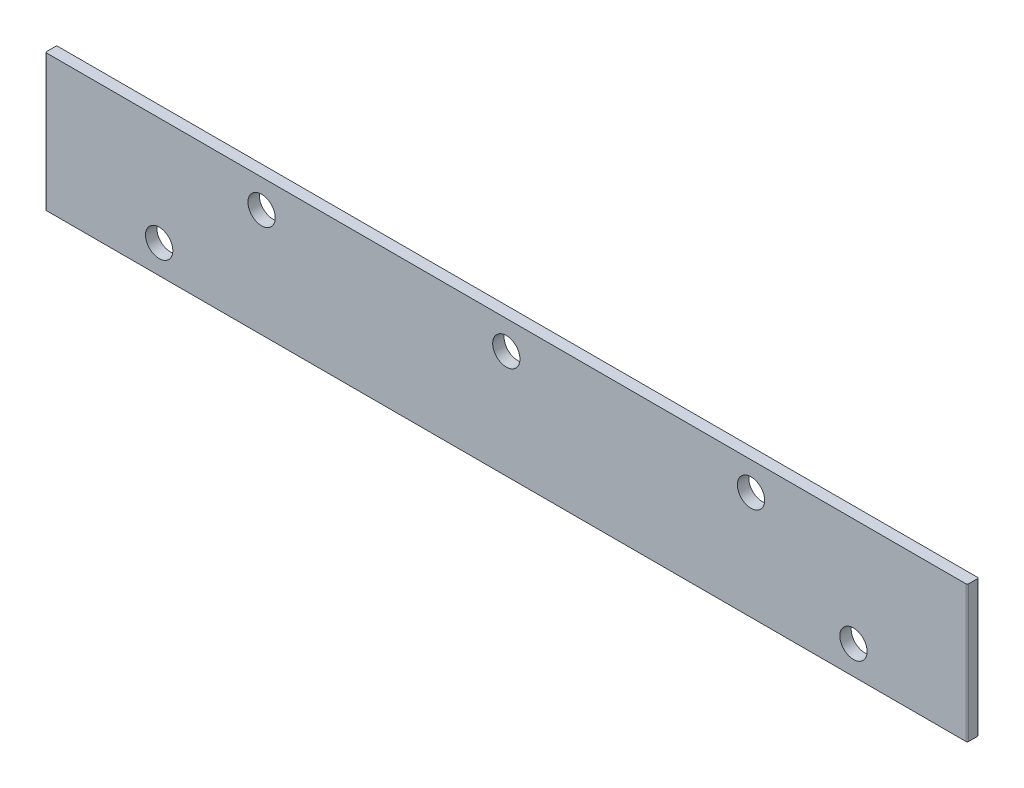
ISO-10303-21;
HEADER;
FILE_DESCRIPTION(('STEP AP214'),'2;1');
FILE_NAME('part.step','',(''),(''),'','','');
FILE_SCHEMA(('AUTOMOTIVE_DESIGN { 1 0 10303 214 1 1 1 1 }'));
ENDSEC;
DATA;
#1=APPLICATION_CONTEXT('core data for automotive mechanical design processes');
#2=APPLICATION_PROTOCOL_DEFINITION('international standard','automotive_design',2000,#1);
#3=PRODUCT_CONTEXT('',#1,'mechanical');
#4=PRODUCT('Part','Part','',(#3));
#5=PRODUCT_RELATED_PRODUCT_CATEGORY('part','',(#4));
#6=PRODUCT_DEFINITION_FORMATION('','',#4);
#7=PRODUCT_DEFINITION_CONTEXT('part definition',#1,'design');
#8=PRODUCT_DEFINITION('design','',#6,#7);
#9=PRODUCT_DEFINITION_SHAPE('','',#8);
#10=(LENGTH_UNIT() NAMED_UNIT(*) SI_UNIT(.MILLI.,.METRE.));
#11=(NAMED_UNIT(*) PLANE_ANGLE_UNIT() SI_UNIT($,.RADIAN.));
#12=(NAMED_UNIT(*) SI_UNIT($,.STERADIAN.) SOLID_ANGLE_UNIT());
#13=UNCERTAINTY_MEASURE_WITH_UNIT(LENGTH_MEASURE(1.E-05),#10,'distance_accuracy_value','');
#14=(GEOMETRIC_REPRESENTATION_CONTEXT(3) GLOBAL_UNCERTAINTY_ASSIGNED_CONTEXT((#13)) GLOBAL_UNIT_ASSIGNED_CONTEXT((#10,
#11,#12)) REPRESENTATION_CONTEXT('',''));
#15=CARTESIAN_POINT('',(0.,0.,0.));
#16=DIRECTION('',(0.,0.,1.));
#17=DIRECTION('',(1.,0.,0.));
#18=AXIS2_PLACEMENT_3D('',#15,#16,#17);
#19=CARTESIAN_POINT('',(40.5000000000001,-6.00000000000001,0.5));
#20=DIRECTION('',(-1.,0.,0.));
#21=DIRECTION('',(0.,0.,1.));
#22=AXIS2_PLACEMENT_3D('',#19,#20,#21);
#23=PLANE('',#22);
#24=DIRECTION('',(0.,0.,-1.));
#25=VECTOR('',#24,1.);
#26=CARTESIAN_POINT('',(40.5000000000001,-6.00000000000001,0.5));
#27=LINE('',#26,#25);
#28=CARTESIAN_POINT('',(40.5000000000001,-6.00000000000001,0.4));
#29=VERTEX_POINT('',#28);
#30=CARTESIAN_POINT('',(40.5000000000001,-6.00000000000001,-0.4));
#31=VERTEX_POINT('',#30);
#32=EDGE_CURVE('E164',#29,#31,#27,.T.);
#33=ORIENTED_EDGE('',*,*,#32,.T.);
#34=DIRECTION('',(0.,1.,0.));
#35=VECTOR('',#34,1.);
#36=CARTESIAN_POINT('',(40.5000000000001,6.00000000000001,-0.4));
#37=LINE('',#36,#35);
#38=CARTESIAN_POINT('',(40.5000000000001,6.00000000000001,-0.4));
#39=VERTEX_POINT('',#38);
#40=EDGE_CURVE('E120',#31,#39,#37,.T.);
#41=ORIENTED_EDGE('',*,*,#40,.T.);
#42=DIRECTION('',(0.,0.,-1.));
#43=VECTOR('',#42,1.);
#44=CARTESIAN_POINT('',(40.5000000000001,6.00000000000001,0.5));
#45=LINE('',#44,#43);
#46=CARTESIAN_POINT('',(40.5000000000001,6.00000000000001,0.4));
#47=VERTEX_POINT('',#46);
#48=EDGE_CURVE('E104',#47,#39,#45,.T.);
#49=ORIENTED_EDGE('',*,*,#48,.F.);
#50=DIRECTION('',(0.,1.,0.));
#51=VECTOR('',#50,1.);
#52=CARTESIAN_POINT('',(40.5000000000001,-6.00000000000001,0.4));
#53=LINE('',#52,#51);
#54=EDGE_CURVE('E117',#47,#29,#53,.F.);
#55=ORIENTED_EDGE('',*,*,#54,.T.);
#56=EDGE_LOOP('',(#33,#41,#49,#55));
#57=FACE_BOUND('',#56,.T.);
#58=ADVANCED_FACE('F35',(#57),#23,.F.);
#59=CARTESIAN_POINT('',(-40.4999999999999,6.00000000000001,0.5));
#60=DIRECTION('',(0.,-1.,0.));
#61=DIRECTION('',(0.,0.,-1.));
#62=AXIS2_PLACEMENT_3D('',#59,#60,#61);
#63=PLANE('',#62);
#64=ORIENTED_EDGE('',*,*,#48,.T.);
#65=CARTESIAN_POINT('',(40.4000000000001,6.00000000000001,-0.4));
#66=DIRECTION('',(0.,-1.,0.));
#67=DIRECTION('',(0.,0.,-1.));
#68=AXIS2_PLACEMENT_3D('',#65,#66,#67);
#69=CIRCLE('',#68,0.1);
#70=CARTESIAN_POINT('',(40.4000000000001,6.00000000000001,-0.5));
#71=VERTEX_POINT('',#70);
#72=EDGE_CURVE('E111',#39,#71,#69,.F.);
#73=ORIENTED_EDGE('',*,*,#72,.T.);
#74=DIRECTION('',(-1.,0.,0.));
#75=VECTOR('',#74,1.);
#76=CARTESIAN_POINT('',(-40.4999999999999,6.00000000000001,-0.5));
#77=LINE('',#76,#75);
#78=CARTESIAN_POINT('',(-40.3999999999999,6.00000000000001,-0.5));
#79=VERTEX_POINT('',#78);
#80=EDGE_CURVE('E171',#71,#79,#77,.T.);
#81=ORIENTED_EDGE('',*,*,#80,.T.);
#82=CARTESIAN_POINT('',(-40.3999999999999,6.00000000000001,-0.4));
#83=DIRECTION('',(0.,-1.,0.));
#84=DIRECTION('',(0.,0.,-1.));
#85=AXIS2_PLACEMENT_3D('',#82,#83,#84);
#86=CIRCLE('',#85,0.1);
#87=CARTESIAN_POINT('',(-40.4999999999999,6.00000000000001,-0.4));
#88=VERTEX_POINT('',#87);
#89=EDGE_CURVE('E112',#79,#88,#86,.F.);
#90=ORIENTED_EDGE('',*,*,#89,.T.);
#91=DIRECTION('',(0.,0.,-1.));
#92=VECTOR('',#91,1.);
#93=CARTESIAN_POINT('',(-40.4999999999999,6.00000000000001,0.5));
#94=LINE('',#93,#92);
#95=CARTESIAN_POINT('',(-40.4999999999999,6.00000000000001,0.4));
#96=VERTEX_POINT('',#95);
#97=EDGE_CURVE('E121',#96,#88,#94,.T.);
#98=ORIENTED_EDGE('',*,*,#97,.F.);
#99=CARTESIAN_POINT('',(-40.3999999999999,6.00000000000001,0.4));
#100=DIRECTION('',(0.,-1.,0.));
#101=DIRECTION('',(0.,0.,-1.));
#102=AXIS2_PLACEMENT_3D('',#99,#100,#101);
#103=CIRCLE('',#102,0.1);
#104=CARTESIAN_POINT('',(-40.3999999999999,6.00000000000001,0.5));
#105=VERTEX_POINT('',#104);
#106=EDGE_CURVE('E127',#96,#105,#103,.F.);
#107=ORIENTED_EDGE('',*,*,#106,.T.);
#108=DIRECTION('',(-1.,0.,0.));
#109=VECTOR('',#108,1.);
#110=CARTESIAN_POINT('',(-40.4999999999999,6.00000000000001,0.5));
#111=LINE('',#110,#109);
#112=CARTESIAN_POINT('',(40.4000000000001,6.00000000000001,0.5));
#113=VERTEX_POINT('',#112);
#114=EDGE_CURVE('E106',#113,#105,#111,.T.);
#115=ORIENTED_EDGE('',*,*,#114,.F.);
#116=CARTESIAN_POINT('',(40.4000000000001,6.00000000000001,0.4));
#117=DIRECTION('',(0.,-1.,0.));
#118=DIRECTION('',(0.,0.,-1.));
#119=AXIS2_PLACEMENT_3D('',#116,#117,#118);
#120=CIRCLE('',#119,0.1);
#121=EDGE_CURVE('E101',#113,#47,#120,.F.);
#122=ORIENTED_EDGE('',*,*,#121,.T.);
#123=EDGE_LOOP('',(#64,#73,#81,#90,#98,#107,#115,#122));
#124=FACE_BOUND('',#123,.T.);
#125=ADVANCED_FACE('F103',(#124),#63,.F.);
#126=CARTESIAN_POINT('',(-40.4999999999999,-6.00000000000001,0.5));
#127=DIRECTION('',(1.,0.,0.));
#128=DIRECTION('',(0.,0.,-1.));
#129=AXIS2_PLACEMENT_3D('',#126,#127,#128);
#130=PLANE('',#129);
#131=ORIENTED_EDGE('',*,*,#97,.T.);
#132=DIRECTION('',(0.,-1.,0.));
#133=VECTOR('',#132,1.);
#134=CARTESIAN_POINT('',(-40.4999999999999,-6.00000000000001,-0.4));
#135=LINE('',#134,#133);
#136=CARTESIAN_POINT('',(-40.4999999999999,-6.00000000000001,-0.4));
#137=VERTEX_POINT('',#136);
#138=EDGE_CURVE('E11',#88,#137,#135,.T.);
#139=ORIENTED_EDGE('',*,*,#138,.T.);
#140=DIRECTION('',(0.,0.,-1.));
#141=VECTOR('',#140,1.);
#142=CARTESIAN_POINT('',(-40.4999999999999,-6.00000000000001,0.5));
#143=LINE('',#142,#141);
#144=CARTESIAN_POINT('',(-40.4999999999999,-6.00000000000001,0.4));
#145=VERTEX_POINT('',#144);
#146=EDGE_CURVE('E152',#145,#137,#143,.T.);
#147=ORIENTED_EDGE('',*,*,#146,.F.);
#148=DIRECTION('',(0.,-1.,0.));
#149=VECTOR('',#148,1.);
#150=CARTESIAN_POINT('',(-40.4999999999999,-6.00000000000001,0.4));
#151=LINE('',#150,#149);
#152=EDGE_CURVE('E43',#145,#96,#151,.F.);
#153=ORIENTED_EDGE('',*,*,#152,.T.);
#154=EDGE_LOOP('',(#131,#139,#147,#153));
#155=FACE_BOUND('',#154,.T.);
#156=ADVANCED_FACE('F151',(#155),#130,.F.);
#157=CARTESIAN_POINT('',(-40.4999999999999,-6.00000000000001,0.5));
#158=DIRECTION('',(0.,1.,0.));
#159=DIRECTION('',(0.,0.,1.));
#160=AXIS2_PLACEMENT_3D('',#157,#158,#159);
#161=PLANE('',#160);
#162=DIRECTION('',(1.,0.,0.));
#163=VECTOR('',#162,1.);
#164=CARTESIAN_POINT('',(-40.4999999999999,-6.00000000000001,-0.5));
#165=LINE('',#164,#163);
#166=CARTESIAN_POINT('',(-40.3999999999999,-6.00000000000001,-0.5));
#167=VERTEX_POINT('',#166);
#168=CARTESIAN_POINT('',(40.4000000000001,-6.00000000000001,-0.5));
#169=VERTEX_POINT('',#168);
#170=EDGE_CURVE('E167',#167,#169,#165,.T.);
#171=ORIENTED_EDGE('',*,*,#170,.T.);
#172=CARTESIAN_POINT('',(40.4000000000001,-6.00000000000001,-0.4));
#173=DIRECTION('',(0.,1.,0.));
#174=DIRECTION('',(0.,0.,1.));
#175=AXIS2_PLACEMENT_3D('',#172,#173,#174);
#176=CIRCLE('',#175,0.1);
#177=EDGE_CURVE('E141',#169,#31,#176,.F.);
#178=ORIENTED_EDGE('',*,*,#177,.T.);
#179=ORIENTED_EDGE('',*,*,#32,.F.);
#180=CARTESIAN_POINT('',(40.4000000000001,-6.00000000000001,0.4));
#181=DIRECTION('',(0.,1.,0.));
#182=DIRECTION('',(0.,0.,1.));
#183=AXIS2_PLACEMENT_3D('',#180,#181,#182);
#184=CIRCLE('',#183,0.1);
#185=CARTESIAN_POINT('',(40.4000000000001,-6.00000000000001,0.5));
#186=VERTEX_POINT('',#185);
#187=EDGE_CURVE('E125',#29,#186,#184,.F.);
#188=ORIENTED_EDGE('',*,*,#187,.T.);
#189=DIRECTION('',(1.,0.,0.));
#190=VECTOR('',#189,1.);
#191=CARTESIAN_POINT('',(-40.4999999999999,-6.00000000000001,0.5));
#192=LINE('',#191,#190);
#193=CARTESIAN_POINT('',(-40.3999999999999,-6.00000000000001,0.5));
#194=VERTEX_POINT('',#193);
#195=EDGE_CURVE('E161',#194,#186,#192,.T.);
#196=ORIENTED_EDGE('',*,*,#195,.F.);
#197=CARTESIAN_POINT('',(-40.3999999999999,-6.00000000000001,0.4));
#198=DIRECTION('',(0.,1.,0.));
#199=DIRECTION('',(0.,0.,1.));
#200=AXIS2_PLACEMENT_3D('',#197,#198,#199);
#201=CIRCLE('',#200,0.1);
#202=EDGE_CURVE('E57',#194,#145,#201,.F.);
#203=ORIENTED_EDGE('',*,*,#202,.T.);
#204=ORIENTED_EDGE('',*,*,#146,.T.);
#205=CARTESIAN_POINT('',(-40.3999999999999,-6.00000000000001,-0.4));
#206=DIRECTION('',(0.,1.,0.));
#207=DIRECTION('',(0.,0.,1.));
#208=AXIS2_PLACEMENT_3D('',#205,#206,#207);
#209=CIRCLE('',#208,0.1);
#210=EDGE_CURVE('E50',#137,#167,#209,.F.);
#211=ORIENTED_EDGE('',*,*,#210,.T.);
#212=EDGE_LOOP('',(#171,#178,#179,#188,#196,#203,#204,#211));
#213=FACE_BOUND('',#212,.T.);
#214=ADVANCED_FACE('F163',(#213),#161,.F.);
#215=CARTESIAN_POINT('',(0.,0.,0.5));
#216=DIRECTION('',(0.,0.,-1.));
#217=DIRECTION('',(-1.,0.,0.));
#218=AXIS2_PLACEMENT_3D('',#215,#216,#217);
#219=PLANE('',#218);
#220=CARTESIAN_POINT('',(0.,3.5,0.5));
#221=DIRECTION('',(0.,0.,1.));
#222=DIRECTION('',(1.,0.,0.));
#223=AXIS2_PLACEMENT_3D('',#220,#221,#222);
#224=CIRCLE('',#223,1.19999999999998);
#225=CARTESIAN_POINT('',(1.19999999999998,3.5,0.5));
#226=VERTEX_POINT('',#225);
#227=EDGE_CURVE('E350',#226,#226,#224,.T.);
#228=ORIENTED_EDGE('',*,*,#227,.F.);
#229=EDGE_LOOP('',(#228));
#230=FACE_BOUND('',#229,.T.);
#231=CARTESIAN_POINT('',(-21.4999999999999,3.5,0.5));
#232=DIRECTION('',(0.,0.,1.));
#233=DIRECTION('',(1.,0.,0.));
#234=AXIS2_PLACEMENT_3D('',#231,#232,#233);
#235=CIRCLE('',#234,1.19999999999999);
#236=CARTESIAN_POINT('',(-20.2999999999999,3.5,0.5));
#237=VERTEX_POINT('',#236);
#238=EDGE_CURVE('E346',#237,#237,#235,.T.);
#239=ORIENTED_EDGE('',*,*,#238,.F.);
#240=EDGE_LOOP('',(#239));
#241=FACE_BOUND('',#240,.T.);
#242=CARTESIAN_POINT('',(21.5000000000001,3.5,0.5));
#243=DIRECTION('',(0.,0.,1.));
#244=DIRECTION('',(1.,0.,0.));
#245=AXIS2_PLACEMENT_3D('',#242,#243,#244);
#246=CIRCLE('',#245,1.19999999999999);
#247=CARTESIAN_POINT('',(22.7000000000001,3.5,0.5));
#248=VERTEX_POINT('',#247);
#249=EDGE_CURVE('E342',#248,#248,#246,.T.);
#250=ORIENTED_EDGE('',*,*,#249,.F.);
#251=EDGE_LOOP('',(#250));
#252=FACE_BOUND('',#251,.T.);
#253=CARTESIAN_POINT('',(-30.4999999999999,-3.49999999999999,0.5));
#254=DIRECTION('',(0.,0.,1.));
#255=DIRECTION('',(1.,0.,0.));
#256=AXIS2_PLACEMENT_3D('',#253,#254,#255);
#257=CIRCLE('',#256,1.19999999999999);
#258=CARTESIAN_POINT('',(-29.2999999999999,-3.49999999999999,0.5));
#259=VERTEX_POINT('',#258);
#260=EDGE_CURVE('E338',#259,#259,#257,.T.);
#261=ORIENTED_EDGE('',*,*,#260,.F.);
#262=EDGE_LOOP('',(#261));
#263=FACE_BOUND('',#262,.T.);
#264=CARTESIAN_POINT('',(30.5000000000001,-3.49999999999999,0.5));
#265=DIRECTION('',(0.,0.,1.));
#266=DIRECTION('',(1.,0.,0.));
#267=AXIS2_PLACEMENT_3D('',#264,#265,#266);
#268=CIRCLE('',#267,1.19999999999999);
#269=CARTESIAN_POINT('',(31.7000000000001,-3.49999999999999,0.5));
#270=VERTEX_POINT('',#269);
#271=EDGE_CURVE('E333',#270,#270,#268,.T.);
#272=ORIENTED_EDGE('',*,*,#271,.F.);
#273=EDGE_LOOP('',(#272));
#274=FACE_BOUND('',#273,.T.);
#275=ORIENTED_EDGE('',*,*,#195,.T.);
#276=DIRECTION('',(0.,1.,0.));
#277=VECTOR('',#276,1.);
#278=CARTESIAN_POINT('',(40.4000000000001,0.,0.5));
#279=LINE('',#278,#277);
#280=EDGE_CURVE('E146',#186,#113,#279,.T.);
#281=ORIENTED_EDGE('',*,*,#280,.T.);
#282=ORIENTED_EDGE('',*,*,#114,.T.);
#283=DIRECTION('',(0.,-1.,0.));
#284=VECTOR('',#283,1.);
#285=CARTESIAN_POINT('',(-40.3999999999999,0.,0.5));
#286=LINE('',#285,#284);
#287=EDGE_CURVE('E143',#105,#194,#286,.T.);
#288=ORIENTED_EDGE('',*,*,#287,.T.);
#289=EDGE_LOOP('',(#275,#281,#282,#288));
#290=FACE_BOUND('',#289,.T.);
#291=ADVANCED_FACE('F160',(#230,#241,#252,#263,#274,#290),#219,.F.);
#292=CARTESIAN_POINT('',(0.,0.,-0.5));
#293=DIRECTION('',(0.,0.,-1.));
#294=DIRECTION('',(-1.,0.,0.));
#295=AXIS2_PLACEMENT_3D('',#292,#293,#294);
#296=PLANE('',#295);
#297=CARTESIAN_POINT('',(0.,3.5,-0.5));
#298=DIRECTION('',(0.,0.,-1.));
#299=DIRECTION('',(-1.,0.,0.));
#300=AXIS2_PLACEMENT_3D('',#297,#298,#299);
#301=CIRCLE('',#300,1.19999999999996);
#302=CARTESIAN_POINT('',(-1.19999999999996,3.5,-0.5));
#303=VERTEX_POINT('',#302);
#304=EDGE_CURVE('E318',#303,#303,#301,.T.);
#305=ORIENTED_EDGE('',*,*,#304,.F.);
#306=EDGE_LOOP('',(#305));
#307=FACE_BOUND('',#306,.T.);
#308=CARTESIAN_POINT('',(-21.4999999999999,3.5,-0.5));
#309=DIRECTION('',(0.,0.,-1.));
#310=DIRECTION('',(-1.,0.,0.));
#311=AXIS2_PLACEMENT_3D('',#308,#309,#310);
#312=CIRCLE('',#311,1.19999999999998);
#313=CARTESIAN_POINT('',(-22.6999999999999,3.5,-0.5));
#314=VERTEX_POINT('',#313);
#315=EDGE_CURVE('E322',#314,#314,#312,.T.);
#316=ORIENTED_EDGE('',*,*,#315,.F.);
#317=EDGE_LOOP('',(#316));
#318=FACE_BOUND('',#317,.T.);
#319=CARTESIAN_POINT('',(21.5000000000001,3.5,-0.5));
#320=DIRECTION('',(0.,0.,-1.));
#321=DIRECTION('',(-1.,0.,0.));
#322=AXIS2_PLACEMENT_3D('',#319,#320,#321);
#323=CIRCLE('',#322,1.19999999999998);
#324=CARTESIAN_POINT('',(20.3000000000001,3.5,-0.5));
#325=VERTEX_POINT('',#324);
#326=EDGE_CURVE('E326',#325,#325,#323,.T.);
#327=ORIENTED_EDGE('',*,*,#326,.F.);
#328=EDGE_LOOP('',(#327));
#329=FACE_BOUND('',#328,.T.);
#330=CARTESIAN_POINT('',(-30.4999999999999,-3.49999999999999,-0.5));
#331=DIRECTION('',(0.,0.,-1.));
#332=DIRECTION('',(-1.,0.,0.));
#333=AXIS2_PLACEMENT_3D('',#330,#331,#332);
#334=CIRCLE('',#333,1.19999999999998);
#335=CARTESIAN_POINT('',(-31.6999999999999,-3.49999999999999,-0.5));
#336=VERTEX_POINT('',#335);
#337=EDGE_CURVE('E330',#336,#336,#334,.T.);
#338=ORIENTED_EDGE('',*,*,#337,.F.);
#339=EDGE_LOOP('',(#338));
#340=FACE_BOUND('',#339,.T.);
#341=CARTESIAN_POINT('',(30.5000000000001,-3.49999999999999,-0.5));
#342=DIRECTION('',(0.,0.,-1.));
#343=DIRECTION('',(-1.,0.,0.));
#344=AXIS2_PLACEMENT_3D('',#341,#342,#343);
#345=CIRCLE('',#344,1.19999999999998);
#346=CARTESIAN_POINT('',(29.3000000000001,-3.49999999999999,-0.5));
#347=VERTEX_POINT('',#346);
#348=EDGE_CURVE('E173',#347,#347,#345,.T.);
#349=ORIENTED_EDGE('',*,*,#348,.F.);
#350=EDGE_LOOP('',(#349));
#351=FACE_BOUND('',#350,.T.);
#352=ORIENTED_EDGE('',*,*,#80,.F.);
#353=DIRECTION('',(0.,1.,0.));
#354=VECTOR('',#353,1.);
#355=CARTESIAN_POINT('',(40.4000000000001,-6.00000000000001,-0.5));
#356=LINE('',#355,#354);
#357=EDGE_CURVE('E136',#71,#169,#356,.F.);
#358=ORIENTED_EDGE('',*,*,#357,.T.);
#359=ORIENTED_EDGE('',*,*,#170,.F.);
#360=DIRECTION('',(0.,-1.,0.));
#361=VECTOR('',#360,1.);
#362=CARTESIAN_POINT('',(-40.3999999999999,6.00000000000001,-0.5));
#363=LINE('',#362,#361);
#364=EDGE_CURVE('E134',#167,#79,#363,.F.);
#365=ORIENTED_EDGE('',*,*,#364,.T.);
#366=EDGE_LOOP('',(#352,#358,#359,#365));
#367=FACE_BOUND('',#366,.T.);
#368=ADVANCED_FACE('F179',(#307,#318,#329,#340,#351,#367),#296,.T.);
#369=CARTESIAN_POINT('',(30.5000000000001,-3.49999999999999,0.5));
#370=DIRECTION('',(0.,0.,1.));
#371=DIRECTION('',(1.,0.,0.));
#372=AXIS2_PLACEMENT_3D('',#369,#370,#371);
#373=CYLINDRICAL_SURFACE('',#372,1.19999999999998);
#374=ORIENTED_EDGE('',*,*,#348,.T.);
#375=EDGE_LOOP('',(#374));
#376=FACE_BOUND('',#375,.T.);
#377=ORIENTED_EDGE('',*,*,#271,.T.);
#378=EDGE_LOOP('',(#377));
#379=FACE_BOUND('',#378,.T.);
#380=ADVANCED_FACE('F221',(#376,#379),#373,.F.);
#381=CARTESIAN_POINT('',(-30.4999999999999,-3.49999999999999,0.5));
#382=DIRECTION('',(0.,0.,1.));
#383=DIRECTION('',(1.,0.,0.));
#384=AXIS2_PLACEMENT_3D('',#381,#382,#383);
#385=CYLINDRICAL_SURFACE('',#384,1.19999999999998);
#386=ORIENTED_EDGE('',*,*,#337,.T.);
#387=EDGE_LOOP('',(#386));
#388=FACE_BOUND('',#387,.T.);
#389=ORIENTED_EDGE('',*,*,#260,.T.);
#390=EDGE_LOOP('',(#389));
#391=FACE_BOUND('',#390,.T.);
#392=ADVANCED_FACE('F217',(#388,#391),#385,.F.);
#393=CARTESIAN_POINT('',(21.5000000000001,3.5,0.5));
#394=DIRECTION('',(0.,0.,1.));
#395=DIRECTION('',(1.,0.,0.));
#396=AXIS2_PLACEMENT_3D('',#393,#394,#395);
#397=CYLINDRICAL_SURFACE('',#396,1.19999999999998);
#398=ORIENTED_EDGE('',*,*,#326,.T.);
#399=EDGE_LOOP('',(#398));
#400=FACE_BOUND('',#399,.T.);
#401=ORIENTED_EDGE('',*,*,#249,.T.);
#402=EDGE_LOOP('',(#401));
#403=FACE_BOUND('',#402,.T.);
#404=ADVANCED_FACE('F209',(#400,#403),#397,.F.);
#405=CARTESIAN_POINT('',(-21.4999999999999,3.5,0.5));
#406=DIRECTION('',(0.,0.,1.));
#407=DIRECTION('',(1.,0.,0.));
#408=AXIS2_PLACEMENT_3D('',#405,#406,#407);
#409=CYLINDRICAL_SURFACE('',#408,1.19999999999998);
#410=ORIENTED_EDGE('',*,*,#315,.T.);
#411=EDGE_LOOP('',(#410));
#412=FACE_BOUND('',#411,.T.);
#413=ORIENTED_EDGE('',*,*,#238,.T.);
#414=EDGE_LOOP('',(#413));
#415=FACE_BOUND('',#414,.T.);
#416=ADVANCED_FACE('F203',(#412,#415),#409,.F.);
#417=CARTESIAN_POINT('',(0.,3.5,0.5));
#418=DIRECTION('',(0.,0.,1.));
#419=DIRECTION('',(1.,0.,0.));
#420=AXIS2_PLACEMENT_3D('',#417,#418,#419);
#421=CYLINDRICAL_SURFACE('',#420,1.19999999999996);
#422=ORIENTED_EDGE('',*,*,#304,.T.);
#423=EDGE_LOOP('',(#422));
#424=FACE_BOUND('',#423,.T.);
#425=ORIENTED_EDGE('',*,*,#227,.T.);
#426=EDGE_LOOP('',(#425));
#427=FACE_BOUND('',#426,.T.);
#428=ADVANCED_FACE('F198',(#424,#427),#421,.F.);
#429=CARTESIAN_POINT('',(40.4000000000001,-6.00000000000001,-0.4));
#430=DIRECTION('',(0.,-1.,0.));
#431=DIRECTION('',(0.,0.,-1.));
#432=AXIS2_PLACEMENT_3D('',#429,#430,#431);
#433=CYLINDRICAL_SURFACE('',#432,0.1);
#434=ORIENTED_EDGE('',*,*,#177,.F.);
#435=ORIENTED_EDGE('',*,*,#357,.F.);
#436=ORIENTED_EDGE('',*,*,#72,.F.);
#437=ORIENTED_EDGE('',*,*,#40,.F.);
#438=EDGE_LOOP('',(#434,#435,#436,#437));
#439=FACE_BOUND('',#438,.T.);
#440=ADVANCED_FACE('F187',(#439),#433,.T.);
#441=CARTESIAN_POINT('',(40.4000000000001,0.,0.4));
#442=DIRECTION('',(0.,1.,0.));
#443=DIRECTION('',(0.,0.,1.));
#444=AXIS2_PLACEMENT_3D('',#441,#442,#443);
#445=CYLINDRICAL_SURFACE('',#444,0.1);
#446=ORIENTED_EDGE('',*,*,#187,.F.);
#447=ORIENTED_EDGE('',*,*,#54,.F.);
#448=ORIENTED_EDGE('',*,*,#121,.F.);
#449=ORIENTED_EDGE('',*,*,#280,.F.);
#450=EDGE_LOOP('',(#446,#447,#448,#449));
#451=FACE_BOUND('',#450,.T.);
#452=ADVANCED_FACE('F124',(#451),#445,.T.);
#453=CARTESIAN_POINT('',(-40.3999999999999,-6.00000000000001,-0.4));
#454=DIRECTION('',(0.,1.,0.));
#455=DIRECTION('',(0.,0.,1.));
#456=AXIS2_PLACEMENT_3D('',#453,#454,#455);
#457=CYLINDRICAL_SURFACE('',#456,0.1);
#458=ORIENTED_EDGE('',*,*,#89,.F.);
#459=ORIENTED_EDGE('',*,*,#364,.F.);
#460=ORIENTED_EDGE('',*,*,#210,.F.);
#461=ORIENTED_EDGE('',*,*,#138,.F.);
#462=EDGE_LOOP('',(#458,#459,#460,#461));
#463=FACE_BOUND('',#462,.T.);
#464=ADVANCED_FACE('F181',(#463),#457,.T.);
#465=CARTESIAN_POINT('',(-40.3999999999999,0.,0.4));
#466=DIRECTION('',(0.,-1.,0.));
#467=DIRECTION('',(0.,0.,-1.));
#468=AXIS2_PLACEMENT_3D('',#465,#466,#467);
#469=CYLINDRICAL_SURFACE('',#468,0.1);
#470=ORIENTED_EDGE('',*,*,#106,.F.);
#471=ORIENTED_EDGE('',*,*,#152,.F.);
#472=ORIENTED_EDGE('',*,*,#202,.F.);
#473=ORIENTED_EDGE('',*,*,#287,.F.);
#474=EDGE_LOOP('',(#470,#471,#472,#473));
#475=FACE_BOUND('',#474,.T.);
#476=ADVANCED_FACE('F37',(#475),#469,.T.);
#477=CLOSED_SHELL('',(#58,#125,#156,#214,#291,#368,#380,#392,#404,#416,#428,#440,#452,#464,#476));
#478=MANIFOLD_SOLID_BREP('B2',#477);
#479=ADVANCED_BREP_SHAPE_REPRESENTATION('',(#18,#478),#14);
#480=SHAPE_DEFINITION_REPRESENTATION(#9,#479);
ENDSEC;
END-ISO-10303-21;
